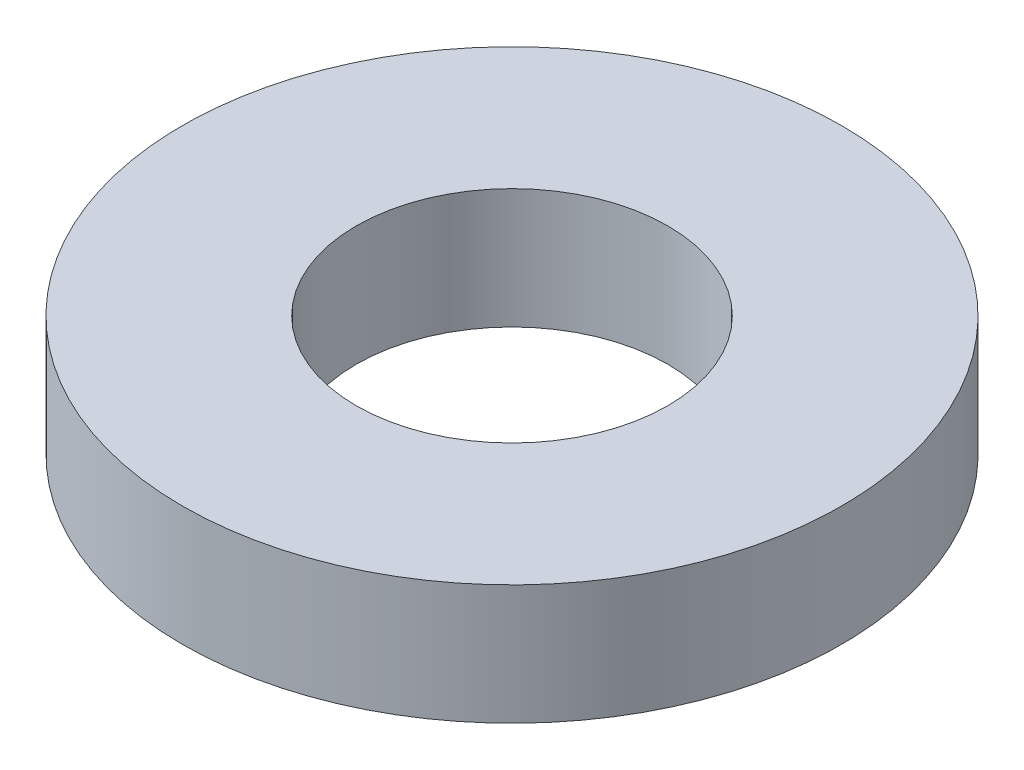
ISO-10303-21;
HEADER;
FILE_DESCRIPTION(('STEP AP214'),'2;1');
FILE_NAME('part.step','',(''),(''),'','','');
FILE_SCHEMA(('AUTOMOTIVE_DESIGN { 1 0 10303 214 1 1 1 1 }'));
ENDSEC;
DATA;
#1=APPLICATION_CONTEXT('core data for automotive mechanical design processes');
#2=APPLICATION_PROTOCOL_DEFINITION('international standard','automotive_design',2000,#1);
#3=PRODUCT_CONTEXT('',#1,'mechanical');
#4=PRODUCT('Part','Part','',(#3));
#5=PRODUCT_RELATED_PRODUCT_CATEGORY('part','',(#4));
#6=PRODUCT_DEFINITION_FORMATION('','',#4);
#7=PRODUCT_DEFINITION_CONTEXT('part definition',#1,'design');
#8=PRODUCT_DEFINITION('design','',#6,#7);
#9=PRODUCT_DEFINITION_SHAPE('','',#8);
#10=(LENGTH_UNIT() NAMED_UNIT(*) SI_UNIT(.MILLI.,.METRE.));
#11=(NAMED_UNIT(*) PLANE_ANGLE_UNIT() SI_UNIT($,.RADIAN.));
#12=(NAMED_UNIT(*) SI_UNIT($,.STERADIAN.) SOLID_ANGLE_UNIT());
#13=UNCERTAINTY_MEASURE_WITH_UNIT(LENGTH_MEASURE(1.E-05),#10,'distance_accuracy_value','');
#14=(GEOMETRIC_REPRESENTATION_CONTEXT(3) GLOBAL_UNCERTAINTY_ASSIGNED_CONTEXT((#13)) GLOBAL_UNIT_ASSIGNED_CONTEXT((#10,
#11,#12)) REPRESENTATION_CONTEXT('',''));
#15=CARTESIAN_POINT('',(0.,0.,0.));
#16=DIRECTION('',(0.,0.,1.));
#17=DIRECTION('',(1.,0.,0.));
#18=AXIS2_PLACEMENT_3D('',#15,#16,#17);
#19=CARTESIAN_POINT('',(-26.3221965773236,2.,-4.60165870968828));
#20=DIRECTION('',(0.,1.,0.));
#21=DIRECTION('',(0.,0.,1.));
#22=AXIS2_PLACEMENT_3D('',#19,#20,#21);
#23=PLANE('',#22);
#24=CARTESIAN_POINT('',(-26.3221965773236,2.,-4.60165870968828));
#25=DIRECTION('',(0.,1.,0.));
#26=DIRECTION('',(0.,0.,1.));
#27=AXIS2_PLACEMENT_3D('',#24,#25,#26);
#28=CIRCLE('',#27,5.5);
#29=CARTESIAN_POINT('',(-26.3221965773236,2.,0.898341290311714));
#30=VERTEX_POINT('',#29);
#31=EDGE_CURVE('E12',#30,#30,#28,.T.);
#32=ORIENTED_EDGE('',*,*,#31,.T.);
#33=EDGE_LOOP('',(#32));
#34=FACE_BOUND('',#33,.T.);
#35=CARTESIAN_POINT('',(-26.3221965773236,2.,-4.60165870968828));
#36=DIRECTION('',(0.,1.,0.));
#37=DIRECTION('',(0.,0.,1.));
#38=AXIS2_PLACEMENT_3D('',#35,#36,#37);
#39=CIRCLE('',#38,2.6);
#40=CARTESIAN_POINT('',(-26.3221965773236,2.,-2.00165870968828));
#41=VERTEX_POINT('',#40);
#42=EDGE_CURVE('E50',#41,#41,#39,.T.);
#43=ORIENTED_EDGE('',*,*,#42,.F.);
#44=EDGE_LOOP('',(#43));
#45=FACE_BOUND('',#44,.T.);
#46=ADVANCED_FACE('F39',(#34,#45),#23,.T.);
#47=CARTESIAN_POINT('',(-26.3221965773236,0.,-4.60165870968828));
#48=DIRECTION('',(0.,1.,0.));
#49=DIRECTION('',(0.,0.,1.));
#50=AXIS2_PLACEMENT_3D('',#47,#48,#49);
#51=PLANE('',#50);
#52=CARTESIAN_POINT('',(-26.3221965773236,0.,-4.60165870968828));
#53=DIRECTION('',(0.,1.,0.));
#54=DIRECTION('',(0.,0.,1.));
#55=AXIS2_PLACEMENT_3D('',#52,#53,#54);
#56=CIRCLE('',#55,5.5);
#57=CARTESIAN_POINT('',(-26.3221965773236,0.,0.898341290311714));
#58=VERTEX_POINT('',#57);
#59=EDGE_CURVE('E43',#58,#58,#56,.T.);
#60=ORIENTED_EDGE('',*,*,#59,.F.);
#61=EDGE_LOOP('',(#60));
#62=FACE_BOUND('',#61,.T.);
#63=CARTESIAN_POINT('',(-26.3221965773236,0.,-4.60165870968828));
#64=DIRECTION('',(0.,1.,0.));
#65=DIRECTION('',(0.,0.,1.));
#66=AXIS2_PLACEMENT_3D('',#63,#64,#65);
#67=CIRCLE('',#66,2.6);
#68=CARTESIAN_POINT('',(-26.3221965773236,0.,-2.00165870968828));
#69=VERTEX_POINT('',#68);
#70=EDGE_CURVE('E52',#69,#69,#67,.T.);
#71=ORIENTED_EDGE('',*,*,#70,.T.);
#72=EDGE_LOOP('',(#71));
#73=FACE_BOUND('',#72,.T.);
#74=ADVANCED_FACE('F62',(#62,#73),#51,.F.);
#75=CARTESIAN_POINT('',(-26.3221965773236,2.,-4.60165870968828));
#76=DIRECTION('',(0.,-1.,0.));
#77=DIRECTION('',(0.,0.,-1.));
#78=AXIS2_PLACEMENT_3D('',#75,#76,#77);
#79=CYLINDRICAL_SURFACE('',#78,5.5);
#80=ORIENTED_EDGE('',*,*,#31,.F.);
#81=EDGE_LOOP('',(#80));
#82=FACE_BOUND('',#81,.T.);
#83=ORIENTED_EDGE('',*,*,#59,.T.);
#84=EDGE_LOOP('',(#83));
#85=FACE_BOUND('',#84,.T.);
#86=ADVANCED_FACE('F41',(#82,#85),#79,.T.);
#87=CARTESIAN_POINT('',(-26.3221965773236,2.,-4.60165870968828));
#88=DIRECTION('',(0.,-1.,0.));
#89=DIRECTION('',(0.,0.,-1.));
#90=AXIS2_PLACEMENT_3D('',#87,#88,#89);
#91=CYLINDRICAL_SURFACE('',#90,2.6);
#92=ORIENTED_EDGE('',*,*,#42,.T.);
#93=EDGE_LOOP('',(#92));
#94=FACE_BOUND('',#93,.T.);
#95=ORIENTED_EDGE('',*,*,#70,.F.);
#96=EDGE_LOOP('',(#95));
#97=FACE_BOUND('',#96,.T.);
#98=ADVANCED_FACE('F58',(#94,#97),#91,.F.);
#99=CLOSED_SHELL('',(#46,#74,#86,#98));
#100=MANIFOLD_SOLID_BREP('B2',#99);
#101=ADVANCED_BREP_SHAPE_REPRESENTATION('',(#18,#100),#14);
#102=SHAPE_DEFINITION_REPRESENTATION(#9,#101);
ENDSEC;
END-ISO-10303-21;
